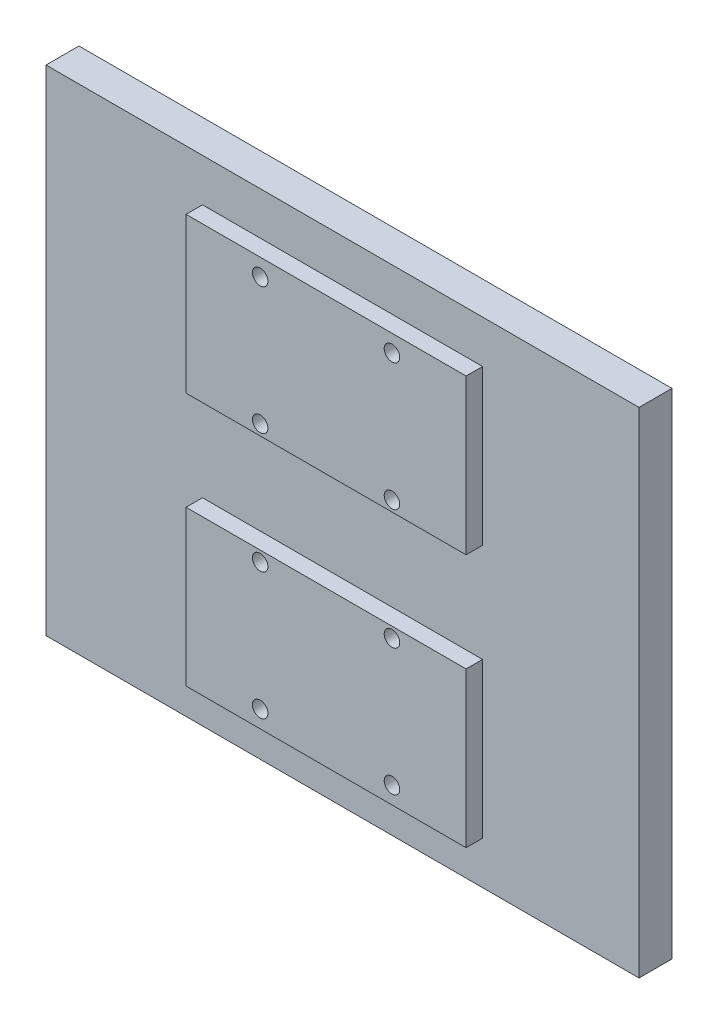
ISO-10303-21;
HEADER;
FILE_DESCRIPTION(('STEP AP214'),'2;1');
FILE_NAME('part.step','',(''),(''),'','','');
FILE_SCHEMA(('AUTOMOTIVE_DESIGN { 1 0 10303 214 1 1 1 1 }'));
ENDSEC;
DATA;
#1=APPLICATION_CONTEXT('core data for automotive mechanical design processes');
#2=APPLICATION_PROTOCOL_DEFINITION('international standard','automotive_design',2000,#1);
#3=PRODUCT_CONTEXT('',#1,'mechanical');
#4=PRODUCT('Part','Part','',(#3));
#5=PRODUCT_RELATED_PRODUCT_CATEGORY('part','',(#4));
#6=PRODUCT_DEFINITION_FORMATION('','',#4);
#7=PRODUCT_DEFINITION_CONTEXT('part definition',#1,'design');
#8=PRODUCT_DEFINITION('design','',#6,#7);
#9=PRODUCT_DEFINITION_SHAPE('','',#8);
#10=(LENGTH_UNIT() NAMED_UNIT(*) SI_UNIT(.MILLI.,.METRE.));
#11=(NAMED_UNIT(*) PLANE_ANGLE_UNIT() SI_UNIT($,.RADIAN.));
#12=(NAMED_UNIT(*) SI_UNIT($,.STERADIAN.) SOLID_ANGLE_UNIT());
#13=UNCERTAINTY_MEASURE_WITH_UNIT(LENGTH_MEASURE(1.E-05),#10,'distance_accuracy_value','');
#14=(GEOMETRIC_REPRESENTATION_CONTEXT(3) GLOBAL_UNCERTAINTY_ASSIGNED_CONTEXT((#13)) GLOBAL_UNIT_ASSIGNED_CONTEXT((#10,
#11,#12)) REPRESENTATION_CONTEXT('',''));
#15=CARTESIAN_POINT('',(0.,0.,0.));
#16=DIRECTION('',(0.,0.,1.));
#17=DIRECTION('',(1.,0.,0.));
#18=AXIS2_PLACEMENT_3D('',#15,#16,#17);
#19=CARTESIAN_POINT('',(-20.,-56.8,0.));
#20=DIRECTION('',(0.,0.,1.));
#21=DIRECTION('',(1.,0.,0.));
#22=AXIS2_PLACEMENT_3D('',#19,#20,#21);
#23=CYLINDRICAL_SURFACE('',#22,2.35);
#24=CARTESIAN_POINT('',(-20.,-56.8,15.));
#25=DIRECTION('',(0.,0.,1.));
#26=DIRECTION('',(1.,0.,0.));
#27=AXIS2_PLACEMENT_3D('',#24,#25,#26);
#28=CIRCLE('',#27,2.35);
#29=CARTESIAN_POINT('',(-17.65,-56.8,15.));
#30=VERTEX_POINT('',#29);
#31=EDGE_CURVE('E327',#30,#30,#28,.F.);
#32=ORIENTED_EDGE('',*,*,#31,.F.);
#33=EDGE_LOOP('',(#32));
#34=FACE_BOUND('',#33,.T.);
#35=CARTESIAN_POINT('',(-20.,-56.8,9.));
#36=DIRECTION('',(0.,0.,-1.));
#37=DIRECTION('',(-1.,0.,0.));
#38=AXIS2_PLACEMENT_3D('',#35,#36,#37);
#39=CIRCLE('',#38,2.35);
#40=CARTESIAN_POINT('',(-22.35,-56.8,9.));
#41=VERTEX_POINT('',#40);
#42=EDGE_CURVE('E47',#41,#41,#39,.T.);
#43=ORIENTED_EDGE('',*,*,#42,.T.);
#44=EDGE_LOOP('',(#43));
#45=FACE_BOUND('',#44,.T.);
#46=ADVANCED_FACE('F43',(#34,#45),#23,.F.);
#47=CARTESIAN_POINT('',(20.,-18.2,0.));
#48=DIRECTION('',(0.,0.,1.));
#49=DIRECTION('',(1.,0.,0.));
#50=AXIS2_PLACEMENT_3D('',#47,#48,#49);
#51=CYLINDRICAL_SURFACE('',#50,2.35);
#52=CARTESIAN_POINT('',(20.,-18.2,15.));
#53=DIRECTION('',(0.,0.,1.));
#54=DIRECTION('',(1.,0.,0.));
#55=AXIS2_PLACEMENT_3D('',#52,#53,#54);
#56=CIRCLE('',#55,2.35);
#57=CARTESIAN_POINT('',(22.35,-18.2,15.));
#58=VERTEX_POINT('',#57);
#59=EDGE_CURVE('E331',#58,#58,#56,.F.);
#60=ORIENTED_EDGE('',*,*,#59,.F.);
#61=EDGE_LOOP('',(#60));
#62=FACE_BOUND('',#61,.T.);
#63=CARTESIAN_POINT('',(20.,-18.2,9.));
#64=DIRECTION('',(0.,0.,-1.));
#65=DIRECTION('',(-1.,0.,0.));
#66=AXIS2_PLACEMENT_3D('',#63,#64,#65);
#67=CIRCLE('',#66,2.35);
#68=CARTESIAN_POINT('',(17.65,-18.2,9.));
#69=VERTEX_POINT('',#68);
#70=EDGE_CURVE('E350',#69,#69,#67,.T.);
#71=ORIENTED_EDGE('',*,*,#70,.T.);
#72=EDGE_LOOP('',(#71));
#73=FACE_BOUND('',#72,.T.);
#74=ADVANCED_FACE('F418',(#62,#73),#51,.F.);
#75=CARTESIAN_POINT('',(20.,-56.8,0.));
#76=DIRECTION('',(0.,0.,1.));
#77=DIRECTION('',(1.,0.,0.));
#78=AXIS2_PLACEMENT_3D('',#75,#76,#77);
#79=CYLINDRICAL_SURFACE('',#78,2.35);
#80=CARTESIAN_POINT('',(20.,-56.8,15.));
#81=DIRECTION('',(0.,0.,1.));
#82=DIRECTION('',(1.,0.,0.));
#83=AXIS2_PLACEMENT_3D('',#80,#81,#82);
#84=CIRCLE('',#83,2.35);
#85=CARTESIAN_POINT('',(22.35,-56.8,15.));
#86=VERTEX_POINT('',#85);
#87=EDGE_CURVE('E335',#86,#86,#84,.F.);
#88=ORIENTED_EDGE('',*,*,#87,.F.);
#89=EDGE_LOOP('',(#88));
#90=FACE_BOUND('',#89,.T.);
#91=CARTESIAN_POINT('',(20.,-56.8,9.));
#92=DIRECTION('',(0.,0.,-1.));
#93=DIRECTION('',(-1.,0.,0.));
#94=AXIS2_PLACEMENT_3D('',#91,#92,#93);
#95=CIRCLE('',#94,2.35);
#96=CARTESIAN_POINT('',(17.65,-56.8,9.));
#97=VERTEX_POINT('',#96);
#98=EDGE_CURVE('E346',#97,#97,#95,.T.);
#99=ORIENTED_EDGE('',*,*,#98,.T.);
#100=EDGE_LOOP('',(#99));
#101=FACE_BOUND('',#100,.T.);
#102=ADVANCED_FACE('F424',(#90,#101),#79,.F.);
#103=CARTESIAN_POINT('',(-20.,-18.2,0.));
#104=DIRECTION('',(0.,0.,1.));
#105=DIRECTION('',(1.,0.,0.));
#106=AXIS2_PLACEMENT_3D('',#103,#104,#105);
#107=CYLINDRICAL_SURFACE('',#106,2.35);
#108=CARTESIAN_POINT('',(-20.,-18.2,15.));
#109=DIRECTION('',(0.,0.,1.));
#110=DIRECTION('',(1.,0.,0.));
#111=AXIS2_PLACEMENT_3D('',#108,#109,#110);
#112=CIRCLE('',#111,2.35);
#113=CARTESIAN_POINT('',(-17.65,-18.2,15.));
#114=VERTEX_POINT('',#113);
#115=EDGE_CURVE('E171',#114,#114,#112,.F.);
#116=ORIENTED_EDGE('',*,*,#115,.F.);
#117=EDGE_LOOP('',(#116));
#118=FACE_BOUND('',#117,.T.);
#119=CARTESIAN_POINT('',(-20.,-18.2,9.));
#120=DIRECTION('',(0.,0.,-1.));
#121=DIRECTION('',(-1.,0.,0.));
#122=AXIS2_PLACEMENT_3D('',#119,#120,#121);
#123=CIRCLE('',#122,2.35);
#124=CARTESIAN_POINT('',(-22.35,-18.2,9.));
#125=VERTEX_POINT('',#124);
#126=EDGE_CURVE('E342',#125,#125,#123,.T.);
#127=ORIENTED_EDGE('',*,*,#126,.T.);
#128=EDGE_LOOP('',(#127));
#129=FACE_BOUND('',#128,.T.);
#130=ADVANCED_FACE('F496',(#118,#129),#107,.F.);
#131=CARTESIAN_POINT('',(-20.,56.8,0.));
#132=DIRECTION('',(0.,0.,1.));
#133=DIRECTION('',(1.,0.,0.));
#134=AXIS2_PLACEMENT_3D('',#131,#132,#133);
#135=CYLINDRICAL_SURFACE('',#134,2.35);
#136=CARTESIAN_POINT('',(-20.,56.8,15.));
#137=DIRECTION('',(0.,0.,1.));
#138=DIRECTION('',(1.,0.,0.));
#139=AXIS2_PLACEMENT_3D('',#136,#137,#138);
#140=CIRCLE('',#139,2.35);
#141=CARTESIAN_POINT('',(-17.65,56.8,15.));
#142=VERTEX_POINT('',#141);
#143=EDGE_CURVE('E297',#142,#142,#140,.T.);
#144=ORIENTED_EDGE('',*,*,#143,.T.);
#145=EDGE_LOOP('',(#144));
#146=FACE_BOUND('',#145,.T.);
#147=CARTESIAN_POINT('',(-20.,56.8,9.));
#148=DIRECTION('',(0.,0.,-1.));
#149=DIRECTION('',(-1.,0.,0.));
#150=AXIS2_PLACEMENT_3D('',#147,#148,#149);
#151=CIRCLE('',#150,2.35);
#152=CARTESIAN_POINT('',(-22.35,56.8,9.));
#153=VERTEX_POINT('',#152);
#154=EDGE_CURVE('E302',#153,#153,#151,.F.);
#155=ORIENTED_EDGE('',*,*,#154,.F.);
#156=EDGE_LOOP('',(#155));
#157=FACE_BOUND('',#156,.T.);
#158=ADVANCED_FACE('F484',(#146,#157),#135,.F.);
#159=CARTESIAN_POINT('',(20.,18.2,0.));
#160=DIRECTION('',(0.,0.,1.));
#161=DIRECTION('',(1.,0.,0.));
#162=AXIS2_PLACEMENT_3D('',#159,#160,#161);
#163=CYLINDRICAL_SURFACE('',#162,2.35);
#164=CARTESIAN_POINT('',(20.,18.2,15.));
#165=DIRECTION('',(0.,0.,1.));
#166=DIRECTION('',(1.,0.,0.));
#167=AXIS2_PLACEMENT_3D('',#164,#165,#166);
#168=CIRCLE('',#167,2.35);
#169=CARTESIAN_POINT('',(22.35,18.2,15.));
#170=VERTEX_POINT('',#169);
#171=EDGE_CURVE('E301',#170,#170,#168,.T.);
#172=ORIENTED_EDGE('',*,*,#171,.T.);
#173=EDGE_LOOP('',(#172));
#174=FACE_BOUND('',#173,.T.);
#175=CARTESIAN_POINT('',(20.,18.2,9.));
#176=DIRECTION('',(0.,0.,-1.));
#177=DIRECTION('',(-1.,0.,0.));
#178=AXIS2_PLACEMENT_3D('',#175,#176,#177);
#179=CIRCLE('',#178,2.35);
#180=CARTESIAN_POINT('',(17.65,18.2,9.));
#181=VERTEX_POINT('',#180);
#182=EDGE_CURVE('E320',#181,#181,#179,.F.);
#183=ORIENTED_EDGE('',*,*,#182,.F.);
#184=EDGE_LOOP('',(#183));
#185=FACE_BOUND('',#184,.T.);
#186=ADVANCED_FACE('F480',(#174,#185),#163,.F.);
#187=CARTESIAN_POINT('',(20.,56.8,0.));
#188=DIRECTION('',(0.,0.,1.));
#189=DIRECTION('',(1.,0.,0.));
#190=AXIS2_PLACEMENT_3D('',#187,#188,#189);
#191=CYLINDRICAL_SURFACE('',#190,2.35);
#192=CARTESIAN_POINT('',(20.,56.8,15.));
#193=DIRECTION('',(0.,0.,1.));
#194=DIRECTION('',(1.,0.,0.));
#195=AXIS2_PLACEMENT_3D('',#192,#193,#194);
#196=CIRCLE('',#195,2.35);
#197=CARTESIAN_POINT('',(22.35,56.8,15.));
#198=VERTEX_POINT('',#197);
#199=EDGE_CURVE('E306',#198,#198,#196,.T.);
#200=ORIENTED_EDGE('',*,*,#199,.T.);
#201=EDGE_LOOP('',(#200));
#202=FACE_BOUND('',#201,.T.);
#203=CARTESIAN_POINT('',(20.,56.8,9.));
#204=DIRECTION('',(0.,0.,-1.));
#205=DIRECTION('',(-1.,0.,0.));
#206=AXIS2_PLACEMENT_3D('',#203,#204,#205);
#207=CIRCLE('',#206,2.35);
#208=CARTESIAN_POINT('',(17.65,56.8,9.));
#209=VERTEX_POINT('',#208);
#210=EDGE_CURVE('E316',#209,#209,#207,.F.);
#211=ORIENTED_EDGE('',*,*,#210,.F.);
#212=EDGE_LOOP('',(#211));
#213=FACE_BOUND('',#212,.T.);
#214=ADVANCED_FACE('F483',(#202,#213),#191,.F.);
#215=CARTESIAN_POINT('',(-20.,18.2,0.));
#216=DIRECTION('',(0.,0.,1.));
#217=DIRECTION('',(1.,0.,0.));
#218=AXIS2_PLACEMENT_3D('',#215,#216,#217);
#219=CYLINDRICAL_SURFACE('',#218,2.35);
#220=CARTESIAN_POINT('',(-20.,18.2,15.));
#221=DIRECTION('',(0.,0.,1.));
#222=DIRECTION('',(1.,0.,0.));
#223=AXIS2_PLACEMENT_3D('',#220,#221,#222);
#224=CIRCLE('',#223,2.35);
#225=CARTESIAN_POINT('',(-17.65,18.2,15.));
#226=VERTEX_POINT('',#225);
#227=EDGE_CURVE('E238',#226,#226,#224,.T.);
#228=ORIENTED_EDGE('',*,*,#227,.T.);
#229=EDGE_LOOP('',(#228));
#230=FACE_BOUND('',#229,.T.);
#231=CARTESIAN_POINT('',(-20.,18.2,9.));
#232=DIRECTION('',(0.,0.,-1.));
#233=DIRECTION('',(-1.,0.,0.));
#234=AXIS2_PLACEMENT_3D('',#231,#232,#233);
#235=CIRCLE('',#234,2.35);
#236=CARTESIAN_POINT('',(-22.35,18.2,9.));
#237=VERTEX_POINT('',#236);
#238=EDGE_CURVE('E214',#237,#237,#235,.F.);
#239=ORIENTED_EDGE('',*,*,#238,.F.);
#240=EDGE_LOOP('',(#239));
#241=FACE_BOUND('',#240,.T.);
#242=ADVANCED_FACE('F486',(#230,#241),#219,.F.);
#243=CARTESIAN_POINT('',(0.,0.,10.));
#244=DIRECTION('',(0.,0.,1.));
#245=DIRECTION('',(1.,0.,0.));
#246=AXIS2_PLACEMENT_3D('',#243,#244,#245);
#247=PLANE('',#246);
#248=DIRECTION('',(0.,-1.,0.));
#249=VECTOR('',#248,1.);
#250=CARTESIAN_POINT('',(42.5,-62.,10.));
#251=LINE('',#250,#249);
#252=CARTESIAN_POINT('',(42.5,-15.,10.));
#253=VERTEX_POINT('',#252);
#254=CARTESIAN_POINT('',(42.5,-62.,10.));
#255=VERTEX_POINT('',#254);
#256=EDGE_CURVE('E140',#253,#255,#251,.T.);
#257=ORIENTED_EDGE('',*,*,#256,.T.);
#258=DIRECTION('',(-1.,0.,0.));
#259=VECTOR('',#258,1.);
#260=CARTESIAN_POINT('',(-42.5,-62.,10.));
#261=LINE('',#260,#259);
#262=CARTESIAN_POINT('',(-42.5,-62.,10.));
#263=VERTEX_POINT('',#262);
#264=EDGE_CURVE('E156',#255,#263,#261,.T.);
#265=ORIENTED_EDGE('',*,*,#264,.T.);
#266=DIRECTION('',(0.,1.,0.));
#267=VECTOR('',#266,1.);
#268=CARTESIAN_POINT('',(-42.5,-62.,10.));
#269=LINE('',#268,#267);
#270=CARTESIAN_POINT('',(-42.5,-15.,10.));
#271=VERTEX_POINT('',#270);
#272=EDGE_CURVE('E66',#263,#271,#269,.T.);
#273=ORIENTED_EDGE('',*,*,#272,.T.);
#274=DIRECTION('',(1.,0.,0.));
#275=VECTOR('',#274,1.);
#276=CARTESIAN_POINT('',(-42.5,-15.,10.));
#277=LINE('',#276,#275);
#278=EDGE_CURVE('E61',#271,#253,#277,.T.);
#279=ORIENTED_EDGE('',*,*,#278,.T.);
#280=EDGE_LOOP('',(#257,#265,#273,#279));
#281=FACE_BOUND('',#280,.T.);
#282=DIRECTION('',(0.,1.,0.));
#283=VECTOR('',#282,1.);
#284=CARTESIAN_POINT('',(90.,75.,10.));
#285=LINE('',#284,#283);
#286=CARTESIAN_POINT('',(90.,-75.,10.));
#287=VERTEX_POINT('',#286);
#288=CARTESIAN_POINT('',(90.,75.,10.));
#289=VERTEX_POINT('',#288);
#290=EDGE_CURVE('E261',#287,#289,#285,.T.);
#291=ORIENTED_EDGE('',*,*,#290,.T.);
#292=DIRECTION('',(-1.,0.,0.));
#293=VECTOR('',#292,1.);
#294=CARTESIAN_POINT('',(-90.,75.,10.));
#295=LINE('',#294,#293);
#296=CARTESIAN_POINT('',(-90.,75.,10.));
#297=VERTEX_POINT('',#296);
#298=EDGE_CURVE('E265',#289,#297,#295,.T.);
#299=ORIENTED_EDGE('',*,*,#298,.T.);
#300=DIRECTION('',(0.,-1.,0.));
#301=VECTOR('',#300,1.);
#302=CARTESIAN_POINT('',(-90.,75.,10.));
#303=LINE('',#302,#301);
#304=CARTESIAN_POINT('',(-90.,-75.,10.));
#305=VERTEX_POINT('',#304);
#306=EDGE_CURVE('E269',#297,#305,#303,.T.);
#307=ORIENTED_EDGE('',*,*,#306,.T.);
#308=DIRECTION('',(1.,0.,0.));
#309=VECTOR('',#308,1.);
#310=CARTESIAN_POINT('',(-90.,-75.,10.));
#311=LINE('',#310,#309);
#312=EDGE_CURVE('E272',#305,#287,#311,.T.);
#313=ORIENTED_EDGE('',*,*,#312,.T.);
#314=EDGE_LOOP('',(#291,#299,#307,#313));
#315=FACE_BOUND('',#314,.T.);
#316=DIRECTION('',(-1.,0.,0.));
#317=VECTOR('',#316,1.);
#318=CARTESIAN_POINT('',(-42.5,62.,10.));
#319=LINE('',#318,#317);
#320=CARTESIAN_POINT('',(42.5,62.,10.));
#321=VERTEX_POINT('',#320);
#322=CARTESIAN_POINT('',(-42.5,62.,10.));
#323=VERTEX_POINT('',#322);
#324=EDGE_CURVE('E237',#321,#323,#319,.T.);
#325=ORIENTED_EDGE('',*,*,#324,.F.);
#326=DIRECTION('',(0.,1.,0.));
#327=VECTOR('',#326,1.);
#328=CARTESIAN_POINT('',(42.5,62.,10.));
#329=LINE('',#328,#327);
#330=CARTESIAN_POINT('',(42.5,15.,10.));
#331=VERTEX_POINT('',#330);
#332=EDGE_CURVE('E233',#331,#321,#329,.T.);
#333=ORIENTED_EDGE('',*,*,#332,.F.);
#334=DIRECTION('',(1.,0.,0.));
#335=VECTOR('',#334,1.);
#336=CARTESIAN_POINT('',(-42.5,15.,10.));
#337=LINE('',#336,#335);
#338=CARTESIAN_POINT('',(-42.5,15.,10.));
#339=VERTEX_POINT('',#338);
#340=EDGE_CURVE('E223',#339,#331,#337,.T.);
#341=ORIENTED_EDGE('',*,*,#340,.F.);
#342=DIRECTION('',(0.,-1.,0.));
#343=VECTOR('',#342,1.);
#344=CARTESIAN_POINT('',(-42.5,62.,10.));
#345=LINE('',#344,#343);
#346=EDGE_CURVE('E241',#323,#339,#345,.T.);
#347=ORIENTED_EDGE('',*,*,#346,.F.);
#348=EDGE_LOOP('',(#325,#333,#341,#347));
#349=FACE_BOUND('',#348,.T.);
#350=ADVANCED_FACE('F489',(#281,#315,#349),#247,.T.);
#351=CARTESIAN_POINT('',(90.,75.,10.));
#352=DIRECTION('',(-1.,0.,0.));
#353=DIRECTION('',(0.,-1.,0.));
#354=AXIS2_PLACEMENT_3D('',#351,#352,#353);
#355=PLANE('',#354);
#356=DIRECTION('',(0.,1.,0.));
#357=VECTOR('',#356,1.);
#358=CARTESIAN_POINT('',(90.,75.,0.));
#359=LINE('',#358,#357);
#360=CARTESIAN_POINT('',(90.,-75.,0.));
#361=VERTEX_POINT('',#360);
#362=CARTESIAN_POINT('',(90.,75.,0.));
#363=VERTEX_POINT('',#362);
#364=EDGE_CURVE('E260',#361,#363,#359,.T.);
#365=ORIENTED_EDGE('',*,*,#364,.T.);
#366=DIRECTION('',(0.,0.,-1.));
#367=VECTOR('',#366,1.);
#368=CARTESIAN_POINT('',(90.,75.,10.));
#369=LINE('',#368,#367);
#370=EDGE_CURVE('E11',#289,#363,#369,.T.);
#371=ORIENTED_EDGE('',*,*,#370,.F.);
#372=ORIENTED_EDGE('',*,*,#290,.F.);
#373=DIRECTION('',(0.,0.,-1.));
#374=VECTOR('',#373,1.);
#375=CARTESIAN_POINT('',(90.,-75.,10.));
#376=LINE('',#375,#374);
#377=EDGE_CURVE('E275',#287,#361,#376,.T.);
#378=ORIENTED_EDGE('',*,*,#377,.T.);
#379=EDGE_LOOP('',(#365,#371,#372,#378));
#380=FACE_BOUND('',#379,.T.);
#381=ADVANCED_FACE('F45',(#380),#355,.F.);
#382=CARTESIAN_POINT('',(-90.,75.,10.));
#383=DIRECTION('',(0.,-1.,0.));
#384=DIRECTION('',(0.,0.,-1.));
#385=AXIS2_PLACEMENT_3D('',#382,#383,#384);
#386=PLANE('',#385);
#387=DIRECTION('',(-1.,0.,0.));
#388=VECTOR('',#387,1.);
#389=CARTESIAN_POINT('',(-90.,75.,0.));
#390=LINE('',#389,#388);
#391=CARTESIAN_POINT('',(-90.,75.,0.));
#392=VERTEX_POINT('',#391);
#393=EDGE_CURVE('E279',#363,#392,#390,.T.);
#394=ORIENTED_EDGE('',*,*,#393,.T.);
#395=DIRECTION('',(0.,0.,-1.));
#396=VECTOR('',#395,1.);
#397=CARTESIAN_POINT('',(-90.,75.,10.));
#398=LINE('',#397,#396);
#399=EDGE_CURVE('E53',#297,#392,#398,.T.);
#400=ORIENTED_EDGE('',*,*,#399,.F.);
#401=ORIENTED_EDGE('',*,*,#298,.F.);
#402=ORIENTED_EDGE('',*,*,#370,.T.);
#403=EDGE_LOOP('',(#394,#400,#401,#402));
#404=FACE_BOUND('',#403,.T.);
#405=ADVANCED_FACE('F529',(#404),#386,.F.);
#406=CARTESIAN_POINT('',(-90.,75.,10.));
#407=DIRECTION('',(1.,0.,0.));
#408=DIRECTION('',(0.,1.,0.));
#409=AXIS2_PLACEMENT_3D('',#406,#407,#408);
#410=PLANE('',#409);
#411=DIRECTION('',(0.,-1.,0.));
#412=VECTOR('',#411,1.);
#413=CARTESIAN_POINT('',(-90.,75.,0.));
#414=LINE('',#413,#412);
#415=CARTESIAN_POINT('',(-90.,-75.,0.));
#416=VERTEX_POINT('',#415);
#417=EDGE_CURVE('E282',#392,#416,#414,.T.);
#418=ORIENTED_EDGE('',*,*,#417,.T.);
#419=DIRECTION('',(0.,0.,-1.));
#420=VECTOR('',#419,1.);
#421=CARTESIAN_POINT('',(-90.,-75.,10.));
#422=LINE('',#421,#420);
#423=EDGE_CURVE('E290',#305,#416,#422,.T.);
#424=ORIENTED_EDGE('',*,*,#423,.F.);
#425=ORIENTED_EDGE('',*,*,#306,.F.);
#426=ORIENTED_EDGE('',*,*,#399,.T.);
#427=EDGE_LOOP('',(#418,#424,#425,#426));
#428=FACE_BOUND('',#427,.T.);
#429=ADVANCED_FACE('F526',(#428),#410,.F.);
#430=CARTESIAN_POINT('',(-90.,-75.,10.));
#431=DIRECTION('',(0.,1.,0.));
#432=DIRECTION('',(0.,0.,1.));
#433=AXIS2_PLACEMENT_3D('',#430,#431,#432);
#434=PLANE('',#433);
#435=DIRECTION('',(1.,0.,0.));
#436=VECTOR('',#435,1.);
#437=CARTESIAN_POINT('',(-90.,-75.,0.));
#438=LINE('',#437,#436);
#439=EDGE_CURVE('E266',#416,#361,#438,.T.);
#440=ORIENTED_EDGE('',*,*,#439,.T.);
#441=ORIENTED_EDGE('',*,*,#377,.F.);
#442=ORIENTED_EDGE('',*,*,#312,.F.);
#443=ORIENTED_EDGE('',*,*,#423,.T.);
#444=EDGE_LOOP('',(#440,#441,#442,#443));
#445=FACE_BOUND('',#444,.T.);
#446=ADVANCED_FACE('F522',(#445),#434,.F.);
#447=CARTESIAN_POINT('',(0.,0.,0.));
#448=DIRECTION('',(0.,0.,1.));
#449=DIRECTION('',(1.,0.,0.));
#450=AXIS2_PLACEMENT_3D('',#447,#448,#449);
#451=PLANE('',#450);
#452=CARTESIAN_POINT('',(20.,-18.2,0.));
#453=DIRECTION('',(0.,0.,1.));
#454=DIRECTION('',(-1.,0.,0.));
#455=AXIS2_PLACEMENT_3D('',#452,#453,#454);
#456=CIRCLE('',#455,4.5);
#457=CARTESIAN_POINT('',(15.5,-18.2,0.));
#458=VERTEX_POINT('',#457);
#459=EDGE_CURVE('E391',#458,#458,#456,.T.);
#460=ORIENTED_EDGE('',*,*,#459,.T.);
#461=EDGE_LOOP('',(#460));
#462=FACE_BOUND('',#461,.T.);
#463=CARTESIAN_POINT('',(-20.,-18.2,0.));
#464=DIRECTION('',(0.,0.,1.));
#465=DIRECTION('',(-1.,0.,0.));
#466=AXIS2_PLACEMENT_3D('',#463,#464,#465);
#467=CIRCLE('',#466,4.5);
#468=CARTESIAN_POINT('',(-24.5,-18.2,0.));
#469=VERTEX_POINT('',#468);
#470=EDGE_CURVE('E383',#469,#469,#467,.T.);
#471=ORIENTED_EDGE('',*,*,#470,.T.);
#472=EDGE_LOOP('',(#471));
#473=FACE_BOUND('',#472,.T.);
#474=CARTESIAN_POINT('',(-20.,-56.8,0.));
#475=DIRECTION('',(0.,0.,1.));
#476=DIRECTION('',(-1.,0.,0.));
#477=AXIS2_PLACEMENT_3D('',#474,#475,#476);
#478=CIRCLE('',#477,4.5);
#479=CARTESIAN_POINT('',(-24.5,-56.8,0.));
#480=VERTEX_POINT('',#479);
#481=EDGE_CURVE('E371',#480,#480,#478,.T.);
#482=ORIENTED_EDGE('',*,*,#481,.T.);
#483=EDGE_LOOP('',(#482));
#484=FACE_BOUND('',#483,.T.);
#485=CARTESIAN_POINT('',(20.,-56.8,0.));
#486=DIRECTION('',(0.,0.,1.));
#487=DIRECTION('',(-1.,0.,0.));
#488=AXIS2_PLACEMENT_3D('',#485,#486,#487);
#489=CIRCLE('',#488,4.5);
#490=CARTESIAN_POINT('',(15.5,-56.8,0.));
#491=VERTEX_POINT('',#490);
#492=EDGE_CURVE('E370',#491,#491,#489,.T.);
#493=ORIENTED_EDGE('',*,*,#492,.T.);
#494=EDGE_LOOP('',(#493));
#495=FACE_BOUND('',#494,.T.);
#496=CARTESIAN_POINT('',(20.,18.2,0.));
#497=DIRECTION('',(0.,0.,-1.));
#498=DIRECTION('',(-1.,0.,0.));
#499=AXIS2_PLACEMENT_3D('',#496,#497,#498);
#500=CIRCLE('',#499,4.5);
#501=CARTESIAN_POINT('',(15.5,18.2,0.));
#502=VERTEX_POINT('',#501);
#503=EDGE_CURVE('E203',#502,#502,#500,.T.);
#504=ORIENTED_EDGE('',*,*,#503,.F.);
#505=EDGE_LOOP('',(#504));
#506=FACE_BOUND('',#505,.T.);
#507=CARTESIAN_POINT('',(-20.,18.2,0.));
#508=DIRECTION('',(0.,0.,-1.));
#509=DIRECTION('',(-1.,0.,0.));
#510=AXIS2_PLACEMENT_3D('',#507,#508,#509);
#511=CIRCLE('',#510,4.5);
#512=CARTESIAN_POINT('',(-24.5,18.2,0.));
#513=VERTEX_POINT('',#512);
#514=EDGE_CURVE('E195',#513,#513,#511,.T.);
#515=ORIENTED_EDGE('',*,*,#514,.F.);
#516=EDGE_LOOP('',(#515));
#517=FACE_BOUND('',#516,.T.);
#518=CARTESIAN_POINT('',(-20.,56.8,0.));
#519=DIRECTION('',(0.,0.,-1.));
#520=DIRECTION('',(-1.,0.,0.));
#521=AXIS2_PLACEMENT_3D('',#518,#519,#520);
#522=CIRCLE('',#521,4.5);
#523=CARTESIAN_POINT('',(-24.5,56.8,0.));
#524=VERTEX_POINT('',#523);
#525=EDGE_CURVE('E186',#524,#524,#522,.T.);
#526=ORIENTED_EDGE('',*,*,#525,.F.);
#527=EDGE_LOOP('',(#526));
#528=FACE_BOUND('',#527,.T.);
#529=CARTESIAN_POINT('',(20.,56.8,0.));
#530=DIRECTION('',(0.,0.,-1.));
#531=DIRECTION('',(-1.,0.,0.));
#532=AXIS2_PLACEMENT_3D('',#529,#530,#531);
#533=CIRCLE('',#532,4.5);
#534=CARTESIAN_POINT('',(15.5,56.8,0.));
#535=VERTEX_POINT('',#534);
#536=EDGE_CURVE('E190',#535,#535,#533,.T.);
#537=ORIENTED_EDGE('',*,*,#536,.F.);
#538=EDGE_LOOP('',(#537));
#539=FACE_BOUND('',#538,.T.);
#540=ORIENTED_EDGE('',*,*,#364,.F.);
#541=ORIENTED_EDGE('',*,*,#439,.F.);
#542=ORIENTED_EDGE('',*,*,#417,.F.);
#543=ORIENTED_EDGE('',*,*,#393,.F.);
#544=EDGE_LOOP('',(#540,#541,#542,#543));
#545=FACE_BOUND('',#544,.T.);
#546=ADVANCED_FACE('F516',(#462,#473,#484,#495,#506,#517,#528,#539,#545),#451,.F.);
#547=CARTESIAN_POINT('',(42.5,62.,15.));
#548=DIRECTION('',(-1.,0.,0.));
#549=DIRECTION('',(0.,-1.,0.));
#550=AXIS2_PLACEMENT_3D('',#547,#548,#549);
#551=PLANE('',#550);
#552=ORIENTED_EDGE('',*,*,#332,.T.);
#553=DIRECTION('',(0.,0.,-1.));
#554=VECTOR('',#553,1.);
#555=CARTESIAN_POINT('',(42.5,62.,15.));
#556=LINE('',#555,#554);
#557=CARTESIAN_POINT('',(42.5,62.,15.));
#558=VERTEX_POINT('',#557);
#559=EDGE_CURVE('E257',#558,#321,#556,.T.);
#560=ORIENTED_EDGE('',*,*,#559,.F.);
#561=DIRECTION('',(0.,1.,0.));
#562=VECTOR('',#561,1.);
#563=CARTESIAN_POINT('',(42.5,62.,15.));
#564=LINE('',#563,#562);
#565=CARTESIAN_POINT('',(42.5,15.,15.));
#566=VERTEX_POINT('',#565);
#567=EDGE_CURVE('E218',#566,#558,#564,.T.);
#568=ORIENTED_EDGE('',*,*,#567,.F.);
#569=DIRECTION('',(0.,0.,-1.));
#570=VECTOR('',#569,1.);
#571=CARTESIAN_POINT('',(42.5,15.,15.));
#572=LINE('',#571,#570);
#573=EDGE_CURVE('E232',#566,#331,#572,.T.);
#574=ORIENTED_EDGE('',*,*,#573,.T.);
#575=EDGE_LOOP('',(#552,#560,#568,#574));
#576=FACE_BOUND('',#575,.T.);
#577=ADVANCED_FACE('F512',(#576),#551,.F.);
#578=CARTESIAN_POINT('',(-42.5,62.,15.));
#579=DIRECTION('',(0.,-1.,0.));
#580=DIRECTION('',(0.,0.,-1.));
#581=AXIS2_PLACEMENT_3D('',#578,#579,#580);
#582=PLANE('',#581);
#583=ORIENTED_EDGE('',*,*,#324,.T.);
#584=DIRECTION('',(0.,0.,-1.));
#585=VECTOR('',#584,1.);
#586=CARTESIAN_POINT('',(-42.5,62.,15.));
#587=LINE('',#586,#585);
#588=CARTESIAN_POINT('',(-42.5,62.,15.));
#589=VERTEX_POINT('',#588);
#590=EDGE_CURVE('E253',#589,#323,#587,.T.);
#591=ORIENTED_EDGE('',*,*,#590,.F.);
#592=DIRECTION('',(-1.,0.,0.));
#593=VECTOR('',#592,1.);
#594=CARTESIAN_POINT('',(-42.5,62.,15.));
#595=LINE('',#594,#593);
#596=EDGE_CURVE('E222',#558,#589,#595,.T.);
#597=ORIENTED_EDGE('',*,*,#596,.F.);
#598=ORIENTED_EDGE('',*,*,#559,.T.);
#599=EDGE_LOOP('',(#583,#591,#597,#598));
#600=FACE_BOUND('',#599,.T.);
#601=ADVANCED_FACE('F508',(#600),#582,.F.);
#602=CARTESIAN_POINT('',(-42.5,62.,15.));
#603=DIRECTION('',(1.,0.,0.));
#604=DIRECTION('',(0.,1.,0.));
#605=AXIS2_PLACEMENT_3D('',#602,#603,#604);
#606=PLANE('',#605);
#607=ORIENTED_EDGE('',*,*,#346,.T.);
#608=DIRECTION('',(0.,0.,-1.));
#609=VECTOR('',#608,1.);
#610=CARTESIAN_POINT('',(-42.5,15.,15.));
#611=LINE('',#610,#609);
#612=CARTESIAN_POINT('',(-42.5,15.,15.));
#613=VERTEX_POINT('',#612);
#614=EDGE_CURVE('E250',#613,#339,#611,.T.);
#615=ORIENTED_EDGE('',*,*,#614,.F.);
#616=DIRECTION('',(0.,-1.,0.));
#617=VECTOR('',#616,1.);
#618=CARTESIAN_POINT('',(-42.5,62.,15.));
#619=LINE('',#618,#617);
#620=EDGE_CURVE('E226',#589,#613,#619,.T.);
#621=ORIENTED_EDGE('',*,*,#620,.F.);
#622=ORIENTED_EDGE('',*,*,#590,.T.);
#623=EDGE_LOOP('',(#607,#615,#621,#622));
#624=FACE_BOUND('',#623,.T.);
#625=ADVANCED_FACE('F504',(#624),#606,.F.);
#626=CARTESIAN_POINT('',(-42.5,15.,15.));
#627=DIRECTION('',(0.,1.,0.));
#628=DIRECTION('',(0.,0.,1.));
#629=AXIS2_PLACEMENT_3D('',#626,#627,#628);
#630=PLANE('',#629);
#631=ORIENTED_EDGE('',*,*,#340,.T.);
#632=ORIENTED_EDGE('',*,*,#573,.F.);
#633=DIRECTION('',(1.,0.,0.));
#634=VECTOR('',#633,1.);
#635=CARTESIAN_POINT('',(-42.5,15.,15.));
#636=LINE('',#635,#634);
#637=EDGE_CURVE('E229',#613,#566,#636,.T.);
#638=ORIENTED_EDGE('',*,*,#637,.F.);
#639=ORIENTED_EDGE('',*,*,#614,.T.);
#640=EDGE_LOOP('',(#631,#632,#638,#639));
#641=FACE_BOUND('',#640,.T.);
#642=ADVANCED_FACE('F500',(#641),#630,.F.);
#643=CARTESIAN_POINT('',(0.,0.,15.));
#644=DIRECTION('',(0.,0.,1.));
#645=DIRECTION('',(1.,0.,0.));
#646=AXIS2_PLACEMENT_3D('',#643,#644,#645);
#647=PLANE('',#646);
#648=ORIENTED_EDGE('',*,*,#227,.F.);
#649=EDGE_LOOP('',(#648));
#650=FACE_BOUND('',#649,.T.);
#651=ORIENTED_EDGE('',*,*,#199,.F.);
#652=EDGE_LOOP('',(#651));
#653=FACE_BOUND('',#652,.T.);
#654=ORIENTED_EDGE('',*,*,#171,.F.);
#655=EDGE_LOOP('',(#654));
#656=FACE_BOUND('',#655,.T.);
#657=ORIENTED_EDGE('',*,*,#143,.F.);
#658=EDGE_LOOP('',(#657));
#659=FACE_BOUND('',#658,.T.);
#660=ORIENTED_EDGE('',*,*,#567,.T.);
#661=ORIENTED_EDGE('',*,*,#596,.T.);
#662=ORIENTED_EDGE('',*,*,#620,.T.);
#663=ORIENTED_EDGE('',*,*,#637,.T.);
#664=EDGE_LOOP('',(#660,#661,#662,#663));
#665=FACE_BOUND('',#664,.T.);
#666=ADVANCED_FACE('F464',(#650,#653,#656,#659,#665),#647,.T.);
#667=CARTESIAN_POINT('',(-20.,18.2,9.));
#668=DIRECTION('',(0.,0.,-1.));
#669=DIRECTION('',(-1.,0.,0.));
#670=AXIS2_PLACEMENT_3D('',#667,#668,#669);
#671=PLANE('',#670);
#672=CARTESIAN_POINT('',(-20.,18.2,9.));
#673=DIRECTION('',(0.,0.,-1.));
#674=DIRECTION('',(-1.,0.,0.));
#675=AXIS2_PLACEMENT_3D('',#672,#673,#674);
#676=CIRCLE('',#675,4.5);
#677=CARTESIAN_POINT('',(-24.5,18.2,9.));
#678=VERTEX_POINT('',#677);
#679=EDGE_CURVE('E199',#678,#678,#676,.T.);
#680=ORIENTED_EDGE('',*,*,#679,.T.);
#681=EDGE_LOOP('',(#680));
#682=FACE_BOUND('',#681,.T.);
#683=ORIENTED_EDGE('',*,*,#238,.T.);
#684=EDGE_LOOP('',(#683));
#685=FACE_BOUND('',#684,.T.);
#686=ADVANCED_FACE('F460',(#682,#685),#671,.T.);
#687=CARTESIAN_POINT('',(-20.,18.2,9.));
#688=DIRECTION('',(0.,0.,-1.));
#689=DIRECTION('',(-1.,0.,0.));
#690=AXIS2_PLACEMENT_3D('',#687,#688,#689);
#691=CYLINDRICAL_SURFACE('',#690,4.5);
#692=ORIENTED_EDGE('',*,*,#679,.F.);
#693=EDGE_LOOP('',(#692));
#694=FACE_BOUND('',#693,.T.);
#695=ORIENTED_EDGE('',*,*,#514,.T.);
#696=EDGE_LOOP('',(#695));
#697=FACE_BOUND('',#696,.T.);
#698=ADVANCED_FACE('F456',(#694,#697),#691,.F.);
#699=CARTESIAN_POINT('',(20.,56.8,9.));
#700=DIRECTION('',(0.,0.,-1.));
#701=DIRECTION('',(-1.,0.,0.));
#702=AXIS2_PLACEMENT_3D('',#699,#700,#701);
#703=PLANE('',#702);
#704=CARTESIAN_POINT('',(20.,56.8,9.));
#705=DIRECTION('',(0.,0.,-1.));
#706=DIRECTION('',(-1.,0.,0.));
#707=AXIS2_PLACEMENT_3D('',#704,#705,#706);
#708=CIRCLE('',#707,4.5);
#709=CARTESIAN_POINT('',(15.5,56.8,9.));
#710=VERTEX_POINT('',#709);
#711=EDGE_CURVE('E210',#710,#710,#708,.T.);
#712=ORIENTED_EDGE('',*,*,#711,.T.);
#713=EDGE_LOOP('',(#712));
#714=FACE_BOUND('',#713,.T.);
#715=ORIENTED_EDGE('',*,*,#210,.T.);
#716=EDGE_LOOP('',(#715));
#717=FACE_BOUND('',#716,.T.);
#718=ADVANCED_FACE('F459',(#714,#717),#703,.T.);
#719=CARTESIAN_POINT('',(20.,56.8,9.));
#720=DIRECTION('',(0.,0.,-1.));
#721=DIRECTION('',(-1.,0.,0.));
#722=AXIS2_PLACEMENT_3D('',#719,#720,#721);
#723=CYLINDRICAL_SURFACE('',#722,4.5);
#724=ORIENTED_EDGE('',*,*,#711,.F.);
#725=EDGE_LOOP('',(#724));
#726=FACE_BOUND('',#725,.T.);
#727=ORIENTED_EDGE('',*,*,#536,.T.);
#728=EDGE_LOOP('',(#727));
#729=FACE_BOUND('',#728,.T.);
#730=ADVANCED_FACE('F472',(#726,#729),#723,.F.);
#731=CARTESIAN_POINT('',(20.,18.2,9.));
#732=DIRECTION('',(0.,0.,-1.));
#733=DIRECTION('',(-1.,0.,0.));
#734=AXIS2_PLACEMENT_3D('',#731,#732,#733);
#735=PLANE('',#734);
#736=CARTESIAN_POINT('',(20.,18.2,9.));
#737=DIRECTION('',(0.,0.,-1.));
#738=DIRECTION('',(-1.,0.,0.));
#739=AXIS2_PLACEMENT_3D('',#736,#737,#738);
#740=CIRCLE('',#739,4.5);
#741=CARTESIAN_POINT('',(15.5,18.2,9.));
#742=VERTEX_POINT('',#741);
#743=EDGE_CURVE('E144',#742,#742,#740,.T.);
#744=ORIENTED_EDGE('',*,*,#743,.T.);
#745=EDGE_LOOP('',(#744));
#746=FACE_BOUND('',#745,.T.);
#747=ORIENTED_EDGE('',*,*,#182,.T.);
#748=EDGE_LOOP('',(#747));
#749=FACE_BOUND('',#748,.T.);
#750=ADVANCED_FACE('F468',(#746,#749),#735,.T.);
#751=CARTESIAN_POINT('',(20.,18.2,9.));
#752=DIRECTION('',(0.,0.,-1.));
#753=DIRECTION('',(-1.,0.,0.));
#754=AXIS2_PLACEMENT_3D('',#751,#752,#753);
#755=CYLINDRICAL_SURFACE('',#754,4.5);
#756=ORIENTED_EDGE('',*,*,#743,.F.);
#757=EDGE_LOOP('',(#756));
#758=FACE_BOUND('',#757,.T.);
#759=ORIENTED_EDGE('',*,*,#503,.T.);
#760=EDGE_LOOP('',(#759));
#761=FACE_BOUND('',#760,.T.);
#762=ADVANCED_FACE('F454',(#758,#761),#755,.F.);
#763=CARTESIAN_POINT('',(-20.,56.8,9.));
#764=DIRECTION('',(0.,0.,-1.));
#765=DIRECTION('',(-1.,0.,0.));
#766=AXIS2_PLACEMENT_3D('',#763,#764,#765);
#767=PLANE('',#766);
#768=CARTESIAN_POINT('',(-20.,56.8,9.));
#769=DIRECTION('',(0.,0.,-1.));
#770=DIRECTION('',(-1.,0.,0.));
#771=AXIS2_PLACEMENT_3D('',#768,#769,#770);
#772=CIRCLE('',#771,4.5);
#773=CARTESIAN_POINT('',(-24.5,56.8,9.));
#774=VERTEX_POINT('',#773);
#775=EDGE_CURVE('E191',#774,#774,#772,.T.);
#776=ORIENTED_EDGE('',*,*,#775,.T.);
#777=EDGE_LOOP('',(#776));
#778=FACE_BOUND('',#777,.T.);
#779=ORIENTED_EDGE('',*,*,#154,.T.);
#780=EDGE_LOOP('',(#779));
#781=FACE_BOUND('',#780,.T.);
#782=ADVANCED_FACE('F450',(#778,#781),#767,.T.);
#783=CARTESIAN_POINT('',(-20.,56.8,9.));
#784=DIRECTION('',(0.,0.,-1.));
#785=DIRECTION('',(-1.,0.,0.));
#786=AXIS2_PLACEMENT_3D('',#783,#784,#785);
#787=CYLINDRICAL_SURFACE('',#786,4.5);
#788=ORIENTED_EDGE('',*,*,#775,.F.);
#789=EDGE_LOOP('',(#788));
#790=FACE_BOUND('',#789,.T.);
#791=ORIENTED_EDGE('',*,*,#525,.T.);
#792=EDGE_LOOP('',(#791));
#793=FACE_BOUND('',#792,.T.);
#794=ADVANCED_FACE('F447',(#790,#793),#787,.F.);
#795=CARTESIAN_POINT('',(42.5,-62.,15.));
#796=DIRECTION('',(1.,0.,0.));
#797=DIRECTION('',(0.,1.,0.));
#798=AXIS2_PLACEMENT_3D('',#795,#796,#797);
#799=PLANE('',#798);
#800=ORIENTED_EDGE('',*,*,#256,.F.);
#801=DIRECTION('',(0.,0.,-1.));
#802=VECTOR('',#801,1.);
#803=CARTESIAN_POINT('',(42.5,-15.,15.));
#804=LINE('',#803,#802);
#805=CARTESIAN_POINT('',(42.5,-15.,15.));
#806=VERTEX_POINT('',#805);
#807=EDGE_CURVE('E134',#806,#253,#804,.T.);
#808=ORIENTED_EDGE('',*,*,#807,.F.);
#809=DIRECTION('',(0.,-1.,0.));
#810=VECTOR('',#809,1.);
#811=CARTESIAN_POINT('',(42.5,-62.,15.));
#812=LINE('',#811,#810);
#813=CARTESIAN_POINT('',(42.5,-62.,15.));
#814=VERTEX_POINT('',#813);
#815=EDGE_CURVE('E138',#806,#814,#812,.T.);
#816=ORIENTED_EDGE('',*,*,#815,.T.);
#817=DIRECTION('',(0.,0.,-1.));
#818=VECTOR('',#817,1.);
#819=CARTESIAN_POINT('',(42.5,-62.,15.));
#820=LINE('',#819,#818);
#821=EDGE_CURVE('E168',#814,#255,#820,.T.);
#822=ORIENTED_EDGE('',*,*,#821,.T.);
#823=EDGE_LOOP('',(#800,#808,#816,#822));
#824=FACE_BOUND('',#823,.T.);
#825=ADVANCED_FACE('F136',(#824),#799,.T.);
#826=CARTESIAN_POINT('',(-42.5,-15.,15.));
#827=DIRECTION('',(0.,1.,0.));
#828=DIRECTION('',(0.,0.,1.));
#829=AXIS2_PLACEMENT_3D('',#826,#827,#828);
#830=PLANE('',#829);
#831=ORIENTED_EDGE('',*,*,#278,.F.);
#832=DIRECTION('',(0.,0.,-1.));
#833=VECTOR('',#832,1.);
#834=CARTESIAN_POINT('',(-42.5,-15.,15.));
#835=LINE('',#834,#833);
#836=CARTESIAN_POINT('',(-42.5,-15.,15.));
#837=VERTEX_POINT('',#836);
#838=EDGE_CURVE('E145',#837,#271,#835,.T.);
#839=ORIENTED_EDGE('',*,*,#838,.F.);
#840=DIRECTION('',(1.,0.,0.));
#841=VECTOR('',#840,1.);
#842=CARTESIAN_POINT('',(-42.5,-15.,15.));
#843=LINE('',#842,#841);
#844=EDGE_CURVE('E151',#837,#806,#843,.T.);
#845=ORIENTED_EDGE('',*,*,#844,.T.);
#846=ORIENTED_EDGE('',*,*,#807,.T.);
#847=EDGE_LOOP('',(#831,#839,#845,#846));
#848=FACE_BOUND('',#847,.T.);
#849=ADVANCED_FACE('F158',(#848),#830,.T.);
#850=CARTESIAN_POINT('',(-42.5,-62.,15.));
#851=DIRECTION('',(-1.,0.,0.));
#852=DIRECTION('',(0.,-1.,0.));
#853=AXIS2_PLACEMENT_3D('',#850,#851,#852);
#854=PLANE('',#853);
#855=ORIENTED_EDGE('',*,*,#272,.F.);
#856=DIRECTION('',(0.,0.,-1.));
#857=VECTOR('',#856,1.);
#858=CARTESIAN_POINT('',(-42.5,-62.,15.));
#859=LINE('',#858,#857);
#860=CARTESIAN_POINT('',(-42.5,-62.,15.));
#861=VERTEX_POINT('',#860);
#862=EDGE_CURVE('E180',#861,#263,#859,.T.);
#863=ORIENTED_EDGE('',*,*,#862,.F.);
#864=DIRECTION('',(0.,1.,0.));
#865=VECTOR('',#864,1.);
#866=CARTESIAN_POINT('',(-42.5,-62.,15.));
#867=LINE('',#866,#865);
#868=EDGE_CURVE('E160',#861,#837,#867,.T.);
#869=ORIENTED_EDGE('',*,*,#868,.T.);
#870=ORIENTED_EDGE('',*,*,#838,.T.);
#871=EDGE_LOOP('',(#855,#863,#869,#870));
#872=FACE_BOUND('',#871,.T.);
#873=ADVANCED_FACE('F438',(#872),#854,.T.);
#874=CARTESIAN_POINT('',(-42.5,-62.,15.));
#875=DIRECTION('',(0.,-1.,0.));
#876=DIRECTION('',(0.,0.,-1.));
#877=AXIS2_PLACEMENT_3D('',#874,#875,#876);
#878=PLANE('',#877);
#879=ORIENTED_EDGE('',*,*,#264,.F.);
#880=ORIENTED_EDGE('',*,*,#821,.F.);
#881=DIRECTION('',(-1.,0.,0.));
#882=VECTOR('',#881,1.);
#883=CARTESIAN_POINT('',(-42.5,-62.,15.));
#884=LINE('',#883,#882);
#885=EDGE_CURVE('E154',#814,#861,#884,.T.);
#886=ORIENTED_EDGE('',*,*,#885,.T.);
#887=ORIENTED_EDGE('',*,*,#862,.T.);
#888=EDGE_LOOP('',(#879,#880,#886,#887));
#889=FACE_BOUND('',#888,.T.);
#890=ADVANCED_FACE('F434',(#889),#878,.T.);
#891=CARTESIAN_POINT('',(0.,0.,15.));
#892=DIRECTION('',(0.,0.,1.));
#893=DIRECTION('',(1.,0.,0.));
#894=AXIS2_PLACEMENT_3D('',#891,#892,#893);
#895=PLANE('',#894);
#896=ORIENTED_EDGE('',*,*,#115,.T.);
#897=EDGE_LOOP('',(#896));
#898=FACE_BOUND('',#897,.T.);
#899=ORIENTED_EDGE('',*,*,#87,.T.);
#900=EDGE_LOOP('',(#899));
#901=FACE_BOUND('',#900,.T.);
#902=ORIENTED_EDGE('',*,*,#59,.T.);
#903=EDGE_LOOP('',(#902));
#904=FACE_BOUND('',#903,.T.);
#905=ORIENTED_EDGE('',*,*,#31,.T.);
#906=EDGE_LOOP('',(#905));
#907=FACE_BOUND('',#906,.T.);
#908=ORIENTED_EDGE('',*,*,#815,.F.);
#909=ORIENTED_EDGE('',*,*,#844,.F.);
#910=ORIENTED_EDGE('',*,*,#868,.F.);
#911=ORIENTED_EDGE('',*,*,#885,.F.);
#912=EDGE_LOOP('',(#908,#909,#910,#911));
#913=FACE_BOUND('',#912,.T.);
#914=ADVANCED_FACE('F149',(#898,#901,#904,#907,#913),#895,.T.);
#915=CARTESIAN_POINT('',(-20.,-18.2,9.));
#916=DIRECTION('',(0.,0.,-1.));
#917=DIRECTION('',(-1.,0.,0.));
#918=AXIS2_PLACEMENT_3D('',#915,#916,#917);
#919=CYLINDRICAL_SURFACE('',#918,4.5);
#920=CARTESIAN_POINT('',(-20.,-18.2,9.));
#921=DIRECTION('',(0.,0.,1.));
#922=DIRECTION('',(-1.,0.,0.));
#923=AXIS2_PLACEMENT_3D('',#920,#921,#922);
#924=CIRCLE('',#923,4.5);
#925=CARTESIAN_POINT('',(-24.5,-18.2,9.));
#926=VERTEX_POINT('',#925);
#927=EDGE_CURVE('E377',#926,#926,#924,.T.);
#928=ORIENTED_EDGE('',*,*,#927,.T.);
#929=EDGE_LOOP('',(#928));
#930=FACE_BOUND('',#929,.T.);
#931=ORIENTED_EDGE('',*,*,#470,.F.);
#932=EDGE_LOOP('',(#931));
#933=FACE_BOUND('',#932,.T.);
#934=ADVANCED_FACE('F433',(#930,#933),#919,.F.);
#935=CARTESIAN_POINT('',(-20.,-18.2,9.));
#936=DIRECTION('',(0.,0.,-1.));
#937=DIRECTION('',(-1.,0.,0.));
#938=AXIS2_PLACEMENT_3D('',#935,#936,#937);
#939=PLANE('',#938);
#940=ORIENTED_EDGE('',*,*,#126,.F.);
#941=EDGE_LOOP('',(#940));
#942=FACE_BOUND('',#941,.T.);
#943=ORIENTED_EDGE('',*,*,#927,.F.);
#944=EDGE_LOOP('',(#943));
#945=FACE_BOUND('',#944,.T.);
#946=ADVANCED_FACE('F414',(#942,#945),#939,.T.);
#947=CARTESIAN_POINT('',(20.,-56.8,9.));
#948=DIRECTION('',(0.,0.,-1.));
#949=DIRECTION('',(-1.,0.,0.));
#950=AXIS2_PLACEMENT_3D('',#947,#948,#949);
#951=CYLINDRICAL_SURFACE('',#950,4.5);
#952=CARTESIAN_POINT('',(20.,-56.8,9.));
#953=DIRECTION('',(0.,0.,1.));
#954=DIRECTION('',(-1.,0.,0.));
#955=AXIS2_PLACEMENT_3D('',#952,#953,#954);
#956=CIRCLE('',#955,4.5);
#957=CARTESIAN_POINT('',(15.5,-56.8,9.));
#958=VERTEX_POINT('',#957);
#959=EDGE_CURVE('E347',#958,#958,#956,.T.);
#960=ORIENTED_EDGE('',*,*,#959,.T.);
#961=EDGE_LOOP('',(#960));
#962=FACE_BOUND('',#961,.T.);
#963=ORIENTED_EDGE('',*,*,#492,.F.);
#964=EDGE_LOOP('',(#963));
#965=FACE_BOUND('',#964,.T.);
#966=ADVANCED_FACE('F399',(#962,#965),#951,.F.);
#967=CARTESIAN_POINT('',(20.,-56.8,9.));
#968=DIRECTION('',(0.,0.,-1.));
#969=DIRECTION('',(-1.,0.,0.));
#970=AXIS2_PLACEMENT_3D('',#967,#968,#969);
#971=PLANE('',#970);
#972=ORIENTED_EDGE('',*,*,#98,.F.);
#973=EDGE_LOOP('',(#972));
#974=FACE_BOUND('',#973,.T.);
#975=ORIENTED_EDGE('',*,*,#959,.F.);
#976=EDGE_LOOP('',(#975));
#977=FACE_BOUND('',#976,.T.);
#978=ADVANCED_FACE('F402',(#974,#977),#971,.T.);
#979=CARTESIAN_POINT('',(20.,-18.2,9.));
#980=DIRECTION('',(0.,0.,-1.));
#981=DIRECTION('',(-1.,0.,0.));
#982=AXIS2_PLACEMENT_3D('',#979,#980,#981);
#983=CYLINDRICAL_SURFACE('',#982,4.5);
#984=CARTESIAN_POINT('',(20.,-18.2,9.));
#985=DIRECTION('',(0.,0.,1.));
#986=DIRECTION('',(-1.,0.,0.));
#987=AXIS2_PLACEMENT_3D('',#984,#985,#986);
#988=CIRCLE('',#987,4.5);
#989=CARTESIAN_POINT('',(15.5,-18.2,9.));
#990=VERTEX_POINT('',#989);
#991=EDGE_CURVE('E387',#990,#990,#988,.T.);
#992=ORIENTED_EDGE('',*,*,#991,.T.);
#993=EDGE_LOOP('',(#992));
#994=FACE_BOUND('',#993,.T.);
#995=ORIENTED_EDGE('',*,*,#459,.F.);
#996=EDGE_LOOP('',(#995));
#997=FACE_BOUND('',#996,.T.);
#998=ADVANCED_FACE('F404',(#994,#997),#983,.F.);
#999=CARTESIAN_POINT('',(20.,-18.2,9.));
#1000=DIRECTION('',(0.,0.,-1.));
#1001=DIRECTION('',(-1.,0.,0.));
#1002=AXIS2_PLACEMENT_3D('',#999,#1000,#1001);
#1003=PLANE('',#1002);
#1004=ORIENTED_EDGE('',*,*,#70,.F.);
#1005=EDGE_LOOP('',(#1004));
#1006=FACE_BOUND('',#1005,.T.);
#1007=ORIENTED_EDGE('',*,*,#991,.F.);
#1008=EDGE_LOOP('',(#1007));
#1009=FACE_BOUND('',#1008,.T.);
#1010=ADVANCED_FACE('F411',(#1006,#1009),#1003,.T.);
#1011=CARTESIAN_POINT('',(-20.,-56.8,9.));
#1012=DIRECTION('',(0.,0.,-1.));
#1013=DIRECTION('',(-1.,0.,0.));
#1014=AXIS2_PLACEMENT_3D('',#1011,#1012,#1013);
#1015=CYLINDRICAL_SURFACE('',#1014,4.5);
#1016=CARTESIAN_POINT('',(-20.,-56.8,9.));
#1017=DIRECTION('',(0.,0.,1.));
#1018=DIRECTION('',(-1.,0.,0.));
#1019=AXIS2_PLACEMENT_3D('',#1016,#1017,#1018);
#1020=CIRCLE('',#1019,4.5);
#1021=CARTESIAN_POINT('',(-24.5,-56.8,9.));
#1022=VERTEX_POINT('',#1021);
#1023=EDGE_CURVE('E367',#1022,#1022,#1020,.T.);
#1024=ORIENTED_EDGE('',*,*,#1023,.T.);
#1025=EDGE_LOOP('',(#1024));
#1026=FACE_BOUND('',#1025,.T.);
#1027=ORIENTED_EDGE('',*,*,#481,.F.);
#1028=EDGE_LOOP('',(#1027));
#1029=FACE_BOUND('',#1028,.T.);
#1030=ADVANCED_FACE('F363',(#1026,#1029),#1015,.F.);
#1031=CARTESIAN_POINT('',(-20.,-56.8,9.));
#1032=DIRECTION('',(0.,0.,-1.));
#1033=DIRECTION('',(-1.,0.,0.));
#1034=AXIS2_PLACEMENT_3D('',#1031,#1032,#1033);
#1035=PLANE('',#1034);
#1036=ORIENTED_EDGE('',*,*,#42,.F.);
#1037=EDGE_LOOP('',(#1036));
#1038=FACE_BOUND('',#1037,.T.);
#1039=ORIENTED_EDGE('',*,*,#1023,.F.);
#1040=EDGE_LOOP('',(#1039));
#1041=FACE_BOUND('',#1040,.T.);
#1042=ADVANCED_FACE('F360',(#1038,#1041),#1035,.T.);
#1043=CLOSED_SHELL('',(#46,#74,#102,#130,#158,#186,#214,#242,#350,#381,#405,#429,#446,#546,#577,
#601,#625,#642,#666,#686,#698,#718,#730,#750,#762,#782,#794,#825,#849,#873,#890,#914,#934,#946,
#966,#978,#998,#1010,#1030,#1042));
#1044=MANIFOLD_SOLID_BREP('B2',#1043);
#1045=ADVANCED_BREP_SHAPE_REPRESENTATION('',(#18,#1044),#14);
#1046=SHAPE_DEFINITION_REPRESENTATION(#9,#1045);
ENDSEC;
END-ISO-10303-21;
